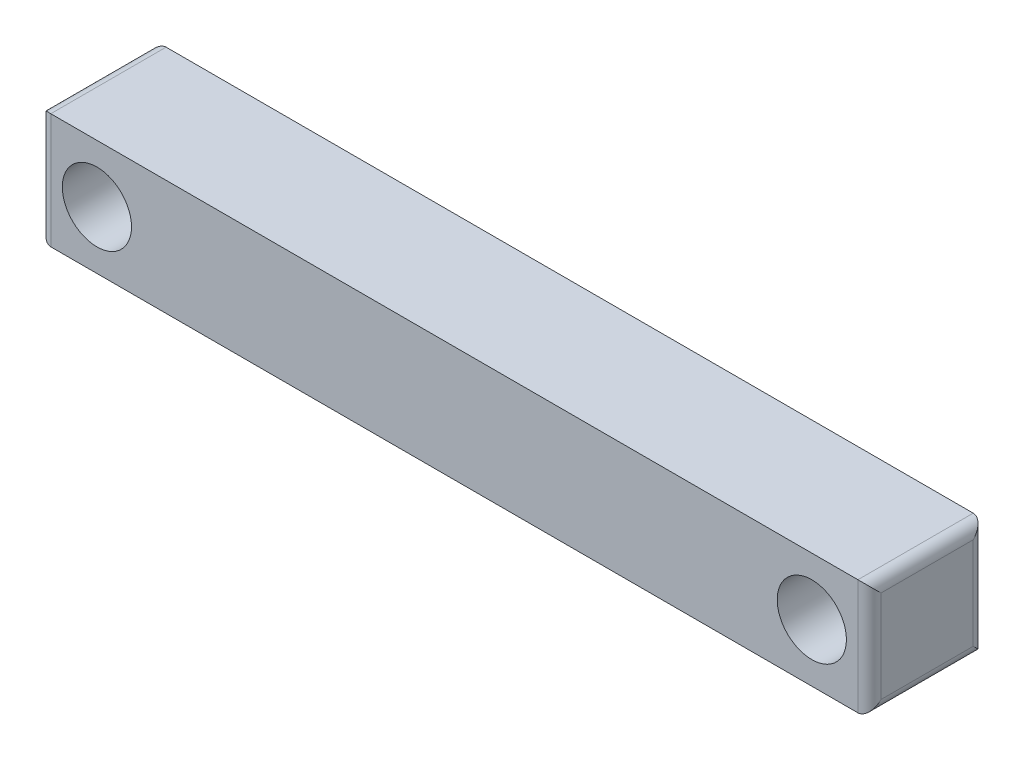
ISO-10303-21;
HEADER;
FILE_DESCRIPTION(('STEP AP214'),'2;1');
FILE_NAME('part.step','',(''),(''),'','','');
FILE_SCHEMA(('AUTOMOTIVE_DESIGN { 1 0 10303 214 1 1 1 1 }'));
ENDSEC;
DATA;
#1=APPLICATION_CONTEXT('core data for automotive mechanical design processes');
#2=APPLICATION_PROTOCOL_DEFINITION('international standard','automotive_design',2000,#1);
#3=PRODUCT_CONTEXT('',#1,'mechanical');
#4=PRODUCT('Part','Part','',(#3));
#5=PRODUCT_RELATED_PRODUCT_CATEGORY('part','',(#4));
#6=PRODUCT_DEFINITION_FORMATION('','',#4);
#7=PRODUCT_DEFINITION_CONTEXT('part definition',#1,'design');
#8=PRODUCT_DEFINITION('design','',#6,#7);
#9=PRODUCT_DEFINITION_SHAPE('','',#8);
#10=(LENGTH_UNIT() NAMED_UNIT(*) SI_UNIT(.MILLI.,.METRE.));
#11=(NAMED_UNIT(*) PLANE_ANGLE_UNIT() SI_UNIT($,.RADIAN.));
#12=(NAMED_UNIT(*) SI_UNIT($,.STERADIAN.) SOLID_ANGLE_UNIT());
#13=UNCERTAINTY_MEASURE_WITH_UNIT(LENGTH_MEASURE(1.E-05),#10,'distance_accuracy_value','');
#14=(GEOMETRIC_REPRESENTATION_CONTEXT(3) GLOBAL_UNCERTAINTY_ASSIGNED_CONTEXT((#13)) GLOBAL_UNIT_ASSIGNED_CONTEXT((#10,
#11,#12)) REPRESENTATION_CONTEXT('',''));
#15=CARTESIAN_POINT('',(0.,0.,0.));
#16=DIRECTION('',(0.,0.,1.));
#17=DIRECTION('',(1.,0.,0.));
#18=AXIS2_PLACEMENT_3D('',#15,#16,#17);
#19=CARTESIAN_POINT('',(0.,0.,25.));
#20=DIRECTION('',(0.,0.,1.));
#21=DIRECTION('',(1.,0.,0.));
#22=AXIS2_PLACEMENT_3D('',#19,#20,#21);
#23=PLANE('',#22);
#24=CARTESIAN_POINT('',(-66.3839537460997,73.0388817149182,25.));
#25=DIRECTION('',(0.,0.,1.));
#26=DIRECTION('',(1.,0.,0.));
#27=AXIS2_PLACEMENT_3D('',#24,#25,#26);
#28=CIRCLE('',#27,7.5);
#29=CARTESIAN_POINT('',(-58.8839537460997,73.0388817149182,25.));
#30=VERTEX_POINT('',#29);
#31=EDGE_CURVE('E192',#30,#30,#28,.T.);
#32=ORIENTED_EDGE('',*,*,#31,.F.);
#33=EDGE_LOOP('',(#32));
#34=FACE_BOUND('',#33,.T.);
#35=DIRECTION('',(1.,0.,0.));
#36=VECTOR('',#35,1.);
#37=CARTESIAN_POINT('',(-78.8839537460997,60.5388817149182,25.));
#38=LINE('',#37,#36);
#39=CARTESIAN_POINT('',(-76.3839537460997,60.5388817149182,25.));
#40=VERTEX_POINT('',#39);
#41=CARTESIAN_POINT('',(98.6160462539003,60.5388817149182,25.));
#42=VERTEX_POINT('',#41);
#43=EDGE_CURVE('E246',#40,#42,#38,.T.);
#44=ORIENTED_EDGE('',*,*,#43,.T.);
#45=DIRECTION('',(0.,1.,0.));
#46=VECTOR('',#45,1.);
#47=CARTESIAN_POINT('',(98.6160462539003,85.5388817149182,25.));
#48=LINE('',#47,#46);
#49=CARTESIAN_POINT('',(98.6160462539003,85.5388817149182,25.));
#50=VERTEX_POINT('',#49);
#51=EDGE_CURVE('E60',#42,#50,#48,.T.);
#52=ORIENTED_EDGE('',*,*,#51,.T.);
#53=DIRECTION('',(-1.,0.,0.));
#54=VECTOR('',#53,1.);
#55=CARTESIAN_POINT('',(-78.8839537460997,85.5388817149182,25.));
#56=LINE('',#55,#54);
#57=CARTESIAN_POINT('',(-76.3839537460997,85.5388817149182,25.));
#58=VERTEX_POINT('',#57);
#59=EDGE_CURVE('E123',#50,#58,#56,.T.);
#60=ORIENTED_EDGE('',*,*,#59,.T.);
#61=DIRECTION('',(0.,-1.,0.));
#62=VECTOR('',#61,1.);
#63=CARTESIAN_POINT('',(-76.3839537460997,60.5388817149182,25.));
#64=LINE('',#63,#62);
#65=EDGE_CURVE('E130',#58,#40,#64,.T.);
#66=ORIENTED_EDGE('',*,*,#65,.T.);
#67=EDGE_LOOP('',(#44,#52,#60,#66));
#68=FACE_BOUND('',#67,.T.);
#69=CARTESIAN_POINT('',(88.6160462539003,73.0388817149182,25.));
#70=DIRECTION('',(0.,0.,1.));
#71=DIRECTION('',(1.,0.,0.));
#72=AXIS2_PLACEMENT_3D('',#69,#70,#71);
#73=CIRCLE('',#72,7.50000000000001);
#74=CARTESIAN_POINT('',(96.1160462539003,73.0388817149182,25.));
#75=VERTEX_POINT('',#74);
#76=EDGE_CURVE('E234',#75,#75,#73,.T.);
#77=ORIENTED_EDGE('',*,*,#76,.F.);
#78=EDGE_LOOP('',(#77));
#79=FACE_BOUND('',#78,.T.);
#80=ADVANCED_FACE('F36',(#34,#68,#79),#23,.T.);
#81=CARTESIAN_POINT('',(0.,0.,0.));
#82=DIRECTION('',(0.,0.,1.));
#83=DIRECTION('',(1.,0.,0.));
#84=AXIS2_PLACEMENT_3D('',#81,#82,#83);
#85=PLANE('',#84);
#86=DIRECTION('',(-1.,0.,0.));
#87=VECTOR('',#86,1.);
#88=CARTESIAN_POINT('',(-78.8839537460997,85.5388817149182,0.));
#89=LINE('',#88,#87);
#90=CARTESIAN_POINT('',(98.6160462539003,85.5388817149182,0.));
#91=VERTEX_POINT('',#90);
#92=CARTESIAN_POINT('',(-76.3839537460997,85.5388817149182,0.));
#93=VERTEX_POINT('',#92);
#94=EDGE_CURVE('E186',#91,#93,#89,.T.);
#95=ORIENTED_EDGE('',*,*,#94,.F.);
#96=DIRECTION('',(0.,1.,0.));
#97=VECTOR('',#96,1.);
#98=CARTESIAN_POINT('',(98.6160462539003,0.,0.));
#99=LINE('',#98,#97);
#100=CARTESIAN_POINT('',(98.6160462539003,60.5388817149182,0.));
#101=VERTEX_POINT('',#100);
#102=EDGE_CURVE('E11',#91,#101,#99,.F.);
#103=ORIENTED_EDGE('',*,*,#102,.T.);
#104=DIRECTION('',(1.,0.,0.));
#105=VECTOR('',#104,1.);
#106=CARTESIAN_POINT('',(-78.8839537460997,60.5388817149182,0.));
#107=LINE('',#106,#105);
#108=CARTESIAN_POINT('',(-76.3839537460997,60.5388817149182,0.));
#109=VERTEX_POINT('',#108);
#110=EDGE_CURVE('E185',#109,#101,#107,.T.);
#111=ORIENTED_EDGE('',*,*,#110,.F.);
#112=DIRECTION('',(0.,-1.,0.));
#113=VECTOR('',#112,1.);
#114=CARTESIAN_POINT('',(-76.3839537460997,0.,0.));
#115=LINE('',#114,#113);
#116=EDGE_CURVE('E138',#109,#93,#115,.F.);
#117=ORIENTED_EDGE('',*,*,#116,.T.);
#118=EDGE_LOOP('',(#95,#103,#111,#117));
#119=FACE_BOUND('',#118,.T.);
#120=CARTESIAN_POINT('',(-66.3839537460997,73.0388817149182,0.));
#121=DIRECTION('',(0.,0.,1.));
#122=DIRECTION('',(1.,0.,0.));
#123=AXIS2_PLACEMENT_3D('',#120,#121,#122);
#124=CIRCLE('',#123,7.5);
#125=CARTESIAN_POINT('',(-58.8839537460997,73.0388817149182,0.));
#126=VERTEX_POINT('',#125);
#127=EDGE_CURVE('E239',#126,#126,#124,.T.);
#128=ORIENTED_EDGE('',*,*,#127,.T.);
#129=EDGE_LOOP('',(#128));
#130=FACE_BOUND('',#129,.T.);
#131=CARTESIAN_POINT('',(88.6160462539003,73.0388817149182,0.));
#132=DIRECTION('',(0.,0.,1.));
#133=DIRECTION('',(1.,0.,0.));
#134=AXIS2_PLACEMENT_3D('',#131,#132,#133);
#135=CIRCLE('',#134,7.50000000000001);
#136=CARTESIAN_POINT('',(96.1160462539003,73.0388817149182,0.));
#137=VERTEX_POINT('',#136);
#138=EDGE_CURVE('E147',#137,#137,#135,.T.);
#139=ORIENTED_EDGE('',*,*,#138,.T.);
#140=EDGE_LOOP('',(#139));
#141=FACE_BOUND('',#140,.T.);
#142=ADVANCED_FACE('F183',(#119,#130,#141),#85,.F.);
#143=CARTESIAN_POINT('',(-78.8839537460997,85.5388817149182,25.));
#144=DIRECTION('',(1.,0.,0.));
#145=DIRECTION('',(0.,1.,0.));
#146=AXIS2_PLACEMENT_3D('',#143,#144,#145);
#147=PLANE('',#146);
#148=DIRECTION('',(0.,-1.,0.));
#149=VECTOR('',#148,1.);
#150=CARTESIAN_POINT('',(-78.8839537460997,85.5388817149182,22.5));
#151=LINE('',#150,#149);
#152=CARTESIAN_POINT('',(-78.8839537460997,63.0388817149182,22.5));
#153=VERTEX_POINT('',#152);
#154=CARTESIAN_POINT('',(-78.8839537460997,83.0388817149182,22.5));
#155=VERTEX_POINT('',#154);
#156=EDGE_CURVE('E127',#153,#155,#151,.F.);
#157=ORIENTED_EDGE('',*,*,#156,.T.);
#158=DIRECTION('',(0.,0.,-1.));
#159=VECTOR('',#158,1.);
#160=CARTESIAN_POINT('',(-78.8839537460997,83.0388817149182,25.));
#161=LINE('',#160,#159);
#162=CARTESIAN_POINT('',(-78.8839537460997,83.0388817149182,2.5));
#163=VERTEX_POINT('',#162);
#164=EDGE_CURVE('E108',#155,#163,#161,.T.);
#165=ORIENTED_EDGE('',*,*,#164,.T.);
#166=DIRECTION('',(0.,-1.,0.));
#167=VECTOR('',#166,1.);
#168=CARTESIAN_POINT('',(-78.8839537460997,85.5388817149182,2.5));
#169=LINE('',#168,#167);
#170=CARTESIAN_POINT('',(-78.8839537460997,63.0388817149182,2.5));
#171=VERTEX_POINT('',#170);
#172=EDGE_CURVE('E116',#163,#171,#169,.T.);
#173=ORIENTED_EDGE('',*,*,#172,.T.);
#174=DIRECTION('',(0.,0.,-1.));
#175=VECTOR('',#174,1.);
#176=CARTESIAN_POINT('',(-78.8839537460997,63.0388817149182,25.));
#177=LINE('',#176,#175);
#178=EDGE_CURVE('E122',#171,#153,#177,.F.);
#179=ORIENTED_EDGE('',*,*,#178,.T.);
#180=EDGE_LOOP('',(#157,#165,#173,#179));
#181=FACE_BOUND('',#180,.T.);
#182=ADVANCED_FACE('F125',(#181),#147,.F.);
#183=CARTESIAN_POINT('',(-78.8839537460997,60.5388817149182,25.));
#184=DIRECTION('',(0.,1.,0.));
#185=DIRECTION('',(0.,0.,1.));
#186=AXIS2_PLACEMENT_3D('',#183,#184,#185);
#187=PLANE('',#186);
#188=ORIENTED_EDGE('',*,*,#110,.T.);
#189=DIRECTION('',(0.,0.,-1.));
#190=VECTOR('',#189,1.);
#191=CARTESIAN_POINT('',(98.6160462539003,60.5388817149182,25.));
#192=LINE('',#191,#190);
#193=EDGE_CURVE('E156',#101,#42,#192,.F.);
#194=ORIENTED_EDGE('',*,*,#193,.T.);
#195=ORIENTED_EDGE('',*,*,#43,.F.);
#196=DIRECTION('',(0.,0.,-1.));
#197=VECTOR('',#196,1.);
#198=CARTESIAN_POINT('',(-76.3839537460997,60.5388817149182,25.));
#199=LINE('',#198,#197);
#200=EDGE_CURVE('E136',#40,#109,#199,.T.);
#201=ORIENTED_EDGE('',*,*,#200,.T.);
#202=EDGE_LOOP('',(#188,#194,#195,#201));
#203=FACE_BOUND('',#202,.T.);
#204=ADVANCED_FACE('F189',(#203),#187,.F.);
#205=CARTESIAN_POINT('',(101.1160462539,85.5388817149182,25.));
#206=DIRECTION('',(-1.,0.,0.));
#207=DIRECTION('',(0.,-1.,0.));
#208=AXIS2_PLACEMENT_3D('',#205,#206,#207);
#209=PLANE('',#208);
#210=DIRECTION('',(0.,1.,0.));
#211=VECTOR('',#210,1.);
#212=CARTESIAN_POINT('',(101.1160462539,60.5388817149182,22.5));
#213=LINE('',#212,#211);
#214=CARTESIAN_POINT('',(101.1160462539,83.0388817149182,22.5));
#215=VERTEX_POINT('',#214);
#216=CARTESIAN_POINT('',(101.1160462539,63.0388817149182,22.5));
#217=VERTEX_POINT('',#216);
#218=EDGE_CURVE('E151',#215,#217,#213,.F.);
#219=ORIENTED_EDGE('',*,*,#218,.T.);
#220=DIRECTION('',(0.,0.,-1.));
#221=VECTOR('',#220,1.);
#222=CARTESIAN_POINT('',(101.1160462539,63.0388817149182,25.));
#223=LINE('',#222,#221);
#224=CARTESIAN_POINT('',(101.1160462539,63.0388817149182,2.5));
#225=VERTEX_POINT('',#224);
#226=EDGE_CURVE('E153',#217,#225,#223,.T.);
#227=ORIENTED_EDGE('',*,*,#226,.T.);
#228=DIRECTION('',(0.,1.,0.));
#229=VECTOR('',#228,1.);
#230=CARTESIAN_POINT('',(101.1160462539,85.5388817149182,2.5));
#231=LINE('',#230,#229);
#232=CARTESIAN_POINT('',(101.1160462539,83.0388817149182,2.5));
#233=VERTEX_POINT('',#232);
#234=EDGE_CURVE('E140',#225,#233,#231,.T.);
#235=ORIENTED_EDGE('',*,*,#234,.T.);
#236=DIRECTION('',(0.,0.,-1.));
#237=VECTOR('',#236,1.);
#238=CARTESIAN_POINT('',(101.1160462539,83.0388817149182,25.));
#239=LINE('',#238,#237);
#240=EDGE_CURVE('E149',#233,#215,#239,.F.);
#241=ORIENTED_EDGE('',*,*,#240,.T.);
#242=EDGE_LOOP('',(#219,#227,#235,#241));
#243=FACE_BOUND('',#242,.T.);
#244=ADVANCED_FACE('F198',(#243),#209,.F.);
#245=CARTESIAN_POINT('',(-78.8839537460997,85.5388817149182,25.));
#246=DIRECTION('',(0.,-1.,0.));
#247=DIRECTION('',(1.,0.,0.));
#248=AXIS2_PLACEMENT_3D('',#245,#246,#247);
#249=PLANE('',#248);
#250=ORIENTED_EDGE('',*,*,#59,.F.);
#251=DIRECTION('',(0.,0.,-1.));
#252=VECTOR('',#251,1.);
#253=CARTESIAN_POINT('',(98.6160462539003,85.5388817149182,25.));
#254=LINE('',#253,#252);
#255=EDGE_CURVE('E45',#50,#91,#254,.T.);
#256=ORIENTED_EDGE('',*,*,#255,.T.);
#257=ORIENTED_EDGE('',*,*,#94,.T.);
#258=DIRECTION('',(0.,0.,-1.));
#259=VECTOR('',#258,1.);
#260=CARTESIAN_POINT('',(-76.3839537460997,85.5388817149182,25.));
#261=LINE('',#260,#259);
#262=EDGE_CURVE('E110',#93,#58,#261,.F.);
#263=ORIENTED_EDGE('',*,*,#262,.T.);
#264=EDGE_LOOP('',(#250,#256,#257,#263));
#265=FACE_BOUND('',#264,.T.);
#266=ADVANCED_FACE('F200',(#265),#249,.F.);
#267=CARTESIAN_POINT('',(-66.3839537460997,73.0388817149182,25.));
#268=DIRECTION('',(0.,0.,-1.));
#269=DIRECTION('',(-1.,0.,0.));
#270=AXIS2_PLACEMENT_3D('',#267,#268,#269);
#271=CYLINDRICAL_SURFACE('',#270,7.5);
#272=ORIENTED_EDGE('',*,*,#31,.T.);
#273=EDGE_LOOP('',(#272));
#274=FACE_BOUND('',#273,.T.);
#275=ORIENTED_EDGE('',*,*,#127,.F.);
#276=EDGE_LOOP('',(#275));
#277=FACE_BOUND('',#276,.T.);
#278=ADVANCED_FACE('F206',(#274,#277),#271,.F.);
#279=CARTESIAN_POINT('',(88.6160462539003,73.0388817149182,25.));
#280=DIRECTION('',(0.,0.,-1.));
#281=DIRECTION('',(-1.,0.,0.));
#282=AXIS2_PLACEMENT_3D('',#279,#280,#281);
#283=CYLINDRICAL_SURFACE('',#282,7.50000000000001);
#284=ORIENTED_EDGE('',*,*,#76,.T.);
#285=EDGE_LOOP('',(#284));
#286=FACE_BOUND('',#285,.T.);
#287=ORIENTED_EDGE('',*,*,#138,.F.);
#288=EDGE_LOOP('',(#287));
#289=FACE_BOUND('',#288,.T.);
#290=ADVANCED_FACE('F220',(#286,#289),#283,.F.);
#291=CARTESIAN_POINT('',(-76.3839537460997,63.0388817149182,25.));
#292=DIRECTION('',(0.,0.,-1.));
#293=DIRECTION('',(-1.,0.,0.));
#294=AXIS2_PLACEMENT_3D('',#291,#292,#293);
#295=CYLINDRICAL_SURFACE('',#294,2.5);
#296=CARTESIAN_POINT('',(-76.3839537460997,63.0388817149182,2.5));
#297=DIRECTION('',(0.,-0.707106781186547,0.707106781186547));
#298=DIRECTION('',(0.,-0.707106781186547,-0.707106781186547));
#299=AXIS2_PLACEMENT_3D('',#296,#297,#298);
#300=ELLIPSE('',#299,3.53553390593274,2.5);
#301=EDGE_CURVE('E119',#109,#171,#300,.F.);
#302=ORIENTED_EDGE('',*,*,#301,.F.);
#303=ORIENTED_EDGE('',*,*,#200,.F.);
#304=CARTESIAN_POINT('',(-76.3839537460997,63.0388817149182,22.5));
#305=DIRECTION('',(0.,-0.707106781186547,-0.707106781186547));
#306=DIRECTION('',(0.,0.707106781186547,-0.707106781186547));
#307=AXIS2_PLACEMENT_3D('',#304,#305,#306);
#308=ELLIPSE('',#307,3.53553390593274,2.5);
#309=EDGE_CURVE('E144',#153,#40,#308,.F.);
#310=ORIENTED_EDGE('',*,*,#309,.F.);
#311=ORIENTED_EDGE('',*,*,#178,.F.);
#312=EDGE_LOOP('',(#302,#303,#310,#311));
#313=FACE_BOUND('',#312,.T.);
#314=ADVANCED_FACE('F223',(#313),#295,.T.);
#315=CARTESIAN_POINT('',(-76.3839537460997,0.,22.5));
#316=DIRECTION('',(0.,1.,0.));
#317=DIRECTION('',(-1.,0.,0.));
#318=AXIS2_PLACEMENT_3D('',#315,#316,#317);
#319=CYLINDRICAL_SURFACE('',#318,2.5);
#320=ORIENTED_EDGE('',*,*,#309,.T.);
#321=ORIENTED_EDGE('',*,*,#65,.F.);
#322=CARTESIAN_POINT('',(-76.3839537460997,83.0388817149182,22.5));
#323=DIRECTION('',(0.,0.707106781186547,-0.707106781186547));
#324=DIRECTION('',(0.,0.707106781186547,0.707106781186547));
#325=AXIS2_PLACEMENT_3D('',#322,#323,#324);
#326=ELLIPSE('',#325,3.53553390593274,2.5);
#327=EDGE_CURVE('E113',#155,#58,#326,.T.);
#328=ORIENTED_EDGE('',*,*,#327,.F.);
#329=ORIENTED_EDGE('',*,*,#156,.F.);
#330=EDGE_LOOP('',(#320,#321,#328,#329));
#331=FACE_BOUND('',#330,.T.);
#332=ADVANCED_FACE('F228',(#331),#319,.T.);
#333=CARTESIAN_POINT('',(-76.3839537460997,85.5388817149182,2.5));
#334=DIRECTION('',(0.,-1.,0.));
#335=DIRECTION('',(1.,0.,0.));
#336=AXIS2_PLACEMENT_3D('',#333,#334,#335);
#337=CYLINDRICAL_SURFACE('',#336,2.5);
#338=ORIENTED_EDGE('',*,*,#301,.T.);
#339=ORIENTED_EDGE('',*,*,#172,.F.);
#340=CARTESIAN_POINT('',(-76.3839537460997,83.0388817149182,2.5));
#341=DIRECTION('',(0.,-0.707106781186547,-0.707106781186547));
#342=DIRECTION('',(0.,-0.707106781186547,0.707106781186547));
#343=AXIS2_PLACEMENT_3D('',#340,#341,#342);
#344=ELLIPSE('',#343,3.53553390593274,2.5);
#345=EDGE_CURVE('E103',#93,#163,#344,.F.);
#346=ORIENTED_EDGE('',*,*,#345,.F.);
#347=ORIENTED_EDGE('',*,*,#116,.F.);
#348=EDGE_LOOP('',(#338,#339,#346,#347));
#349=FACE_BOUND('',#348,.T.);
#350=ADVANCED_FACE('F117',(#349),#337,.T.);
#351=CARTESIAN_POINT('',(-76.3839537460997,83.0388817149182,25.));
#352=DIRECTION('',(0.,0.,-1.));
#353=DIRECTION('',(-1.,0.,0.));
#354=AXIS2_PLACEMENT_3D('',#351,#352,#353);
#355=CYLINDRICAL_SURFACE('',#354,2.5);
#356=ORIENTED_EDGE('',*,*,#327,.T.);
#357=ORIENTED_EDGE('',*,*,#262,.F.);
#358=ORIENTED_EDGE('',*,*,#345,.T.);
#359=ORIENTED_EDGE('',*,*,#164,.F.);
#360=EDGE_LOOP('',(#356,#357,#358,#359));
#361=FACE_BOUND('',#360,.T.);
#362=ADVANCED_FACE('F106',(#361),#355,.T.);
#363=CARTESIAN_POINT('',(98.6160462539003,83.0388817149182,25.));
#364=DIRECTION('',(0.,0.,-1.));
#365=DIRECTION('',(-1.,0.,0.));
#366=AXIS2_PLACEMENT_3D('',#363,#364,#365);
#367=CYLINDRICAL_SURFACE('',#366,2.5);
#368=CARTESIAN_POINT('',(98.6160462539003,83.0388817149182,2.5));
#369=DIRECTION('',(0.,0.707106781186547,0.707106781186547));
#370=DIRECTION('',(0.,0.707106781186547,-0.707106781186547));
#371=AXIS2_PLACEMENT_3D('',#368,#369,#370);
#372=ELLIPSE('',#371,3.53553390593274,2.5);
#373=EDGE_CURVE('E164',#91,#233,#372,.F.);
#374=ORIENTED_EDGE('',*,*,#373,.F.);
#375=ORIENTED_EDGE('',*,*,#255,.F.);
#376=CARTESIAN_POINT('',(98.6160462539003,83.0388817149182,22.5));
#377=DIRECTION('',(0.,0.707106781186547,-0.707106781186547));
#378=DIRECTION('',(0.,-0.707106781186547,-0.707106781186547));
#379=AXIS2_PLACEMENT_3D('',#376,#377,#378);
#380=ELLIPSE('',#379,3.53553390593274,2.5);
#381=EDGE_CURVE('E40',#215,#50,#380,.F.);
#382=ORIENTED_EDGE('',*,*,#381,.F.);
#383=ORIENTED_EDGE('',*,*,#240,.F.);
#384=EDGE_LOOP('',(#374,#375,#382,#383));
#385=FACE_BOUND('',#384,.T.);
#386=ADVANCED_FACE('F38',(#385),#367,.T.);
#387=CARTESIAN_POINT('',(98.6160462539003,0.,22.5));
#388=DIRECTION('',(0.,-1.,0.));
#389=DIRECTION('',(1.,0.,0.));
#390=AXIS2_PLACEMENT_3D('',#387,#388,#389);
#391=CYLINDRICAL_SURFACE('',#390,2.5);
#392=ORIENTED_EDGE('',*,*,#381,.T.);
#393=ORIENTED_EDGE('',*,*,#51,.F.);
#394=CARTESIAN_POINT('',(98.6160462539003,63.0388817149182,22.5));
#395=DIRECTION('',(0.,-0.707106781186547,-0.707106781186547));
#396=DIRECTION('',(0.,-0.707106781186547,0.707106781186547));
#397=AXIS2_PLACEMENT_3D('',#394,#395,#396);
#398=ELLIPSE('',#397,3.53553390593274,2.5);
#399=EDGE_CURVE('E163',#217,#42,#398,.T.);
#400=ORIENTED_EDGE('',*,*,#399,.F.);
#401=ORIENTED_EDGE('',*,*,#218,.F.);
#402=EDGE_LOOP('',(#392,#393,#400,#401));
#403=FACE_BOUND('',#402,.T.);
#404=ADVANCED_FACE('F174',(#403),#391,.T.);
#405=CARTESIAN_POINT('',(98.6160462539003,85.5388817149182,2.5));
#406=DIRECTION('',(0.,1.,0.));
#407=DIRECTION('',(-1.,0.,0.));
#408=AXIS2_PLACEMENT_3D('',#405,#406,#407);
#409=CYLINDRICAL_SURFACE('',#408,2.5);
#410=ORIENTED_EDGE('',*,*,#373,.T.);
#411=ORIENTED_EDGE('',*,*,#234,.F.);
#412=CARTESIAN_POINT('',(98.6160462539003,63.0388817149182,2.5));
#413=DIRECTION('',(0.,0.707106781186547,-0.707106781186547));
#414=DIRECTION('',(0.,0.707106781186547,0.707106781186547));
#415=AXIS2_PLACEMENT_3D('',#412,#413,#414);
#416=ELLIPSE('',#415,3.53553390593274,2.5);
#417=EDGE_CURVE('E161',#101,#225,#416,.F.);
#418=ORIENTED_EDGE('',*,*,#417,.F.);
#419=ORIENTED_EDGE('',*,*,#102,.F.);
#420=EDGE_LOOP('',(#410,#411,#418,#419));
#421=FACE_BOUND('',#420,.T.);
#422=ADVANCED_FACE('F179',(#421),#409,.T.);
#423=CARTESIAN_POINT('',(98.6160462539003,63.0388817149182,25.));
#424=DIRECTION('',(0.,0.,-1.));
#425=DIRECTION('',(-1.,0.,0.));
#426=AXIS2_PLACEMENT_3D('',#423,#424,#425);
#427=CYLINDRICAL_SURFACE('',#426,2.5);
#428=ORIENTED_EDGE('',*,*,#399,.T.);
#429=ORIENTED_EDGE('',*,*,#193,.F.);
#430=ORIENTED_EDGE('',*,*,#417,.T.);
#431=ORIENTED_EDGE('',*,*,#226,.F.);
#432=EDGE_LOOP('',(#428,#429,#430,#431));
#433=FACE_BOUND('',#432,.T.);
#434=ADVANCED_FACE('F195',(#433),#427,.T.);
#435=CLOSED_SHELL('',(#80,#142,#182,#204,#244,#266,#278,#290,#314,#332,#350,#362,#386,#404,#422,#434));
#436=MANIFOLD_SOLID_BREP('B2',#435);
#437=ADVANCED_BREP_SHAPE_REPRESENTATION('',(#18,#436),#14);
#438=SHAPE_DEFINITION_REPRESENTATION(#9,#437);
ENDSEC;
END-ISO-10303-21;
